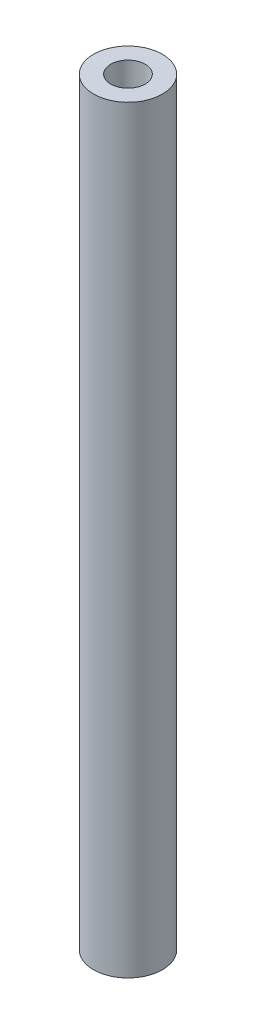
ISO-10303-21;
HEADER;
FILE_DESCRIPTION(('STEP AP214'),'2;1');
FILE_NAME('part.step','',(''),(''),'','','');
FILE_SCHEMA(('AUTOMOTIVE_DESIGN { 1 0 10303 214 1 1 1 1 }'));
ENDSEC;
DATA;
#1=APPLICATION_CONTEXT('core data for automotive mechanical design processes');
#2=APPLICATION_PROTOCOL_DEFINITION('international standard','automotive_design',2000,#1);
#3=PRODUCT_CONTEXT('',#1,'mechanical');
#4=PRODUCT('Part','Part','',(#3));
#5=PRODUCT_RELATED_PRODUCT_CATEGORY('part','',(#4));
#6=PRODUCT_DEFINITION_FORMATION('','',#4);
#7=PRODUCT_DEFINITION_CONTEXT('part definition',#1,'design');
#8=PRODUCT_DEFINITION('design','',#6,#7);
#9=PRODUCT_DEFINITION_SHAPE('','',#8);
#10=(LENGTH_UNIT() NAMED_UNIT(*) SI_UNIT(.MILLI.,.METRE.));
#11=(NAMED_UNIT(*) PLANE_ANGLE_UNIT() SI_UNIT($,.RADIAN.));
#12=(NAMED_UNIT(*) SI_UNIT($,.STERADIAN.) SOLID_ANGLE_UNIT());
#13=UNCERTAINTY_MEASURE_WITH_UNIT(LENGTH_MEASURE(1.E-05),#10,'distance_accuracy_value','');
#14=(GEOMETRIC_REPRESENTATION_CONTEXT(3) GLOBAL_UNCERTAINTY_ASSIGNED_CONTEXT((#13)) GLOBAL_UNIT_ASSIGNED_CONTEXT((#10,
#11,#12)) REPRESENTATION_CONTEXT('',''));
#15=CARTESIAN_POINT('',(0.,0.,0.));
#16=DIRECTION('',(0.,0.,1.));
#17=DIRECTION('',(1.,0.,0.));
#18=AXIS2_PLACEMENT_3D('',#15,#16,#17);
#19=CARTESIAN_POINT('',(-58.1882179487252,55.,19.3502353782833));
#20=DIRECTION('',(0.,-1.,0.));
#21=DIRECTION('',(0.,0.,-1.));
#22=AXIS2_PLACEMENT_3D('',#19,#20,#21);
#23=CYLINDRICAL_SURFACE('',#22,2.5);
#24=CARTESIAN_POINT('',(-58.1882179487252,55.,19.3502353782833));
#25=DIRECTION('',(0.,1.,0.));
#26=DIRECTION('',(0.,0.,1.));
#27=AXIS2_PLACEMENT_3D('',#24,#25,#26);
#28=CIRCLE('',#27,2.5);
#29=CARTESIAN_POINT('',(-58.1882179487252,55.,21.8502353782833));
#30=VERTEX_POINT('',#29);
#31=EDGE_CURVE('E12',#30,#30,#28,.T.);
#32=ORIENTED_EDGE('',*,*,#31,.F.);
#33=EDGE_LOOP('',(#32));
#34=FACE_BOUND('',#33,.T.);
#35=CARTESIAN_POINT('',(-58.1882179487252,0.,19.3502353782833));
#36=DIRECTION('',(0.,1.,0.));
#37=DIRECTION('',(0.,0.,1.));
#38=AXIS2_PLACEMENT_3D('',#35,#36,#37);
#39=CIRCLE('',#38,2.5);
#40=CARTESIAN_POINT('',(-58.1882179487252,0.,21.8502353782833));
#41=VERTEX_POINT('',#40);
#42=EDGE_CURVE('E45',#41,#41,#39,.T.);
#43=ORIENTED_EDGE('',*,*,#42,.T.);
#44=EDGE_LOOP('',(#43));
#45=FACE_BOUND('',#44,.T.);
#46=ADVANCED_FACE('F42',(#34,#45),#23,.T.);
#47=CARTESIAN_POINT('',(-58.1882179487252,55.,19.3502353782833));
#48=DIRECTION('',(0.,1.,0.));
#49=DIRECTION('',(0.,0.,1.));
#50=AXIS2_PLACEMENT_3D('',#47,#48,#49);
#51=PLANE('',#50);
#52=CARTESIAN_POINT('',(-58.1882179487252,55.,19.3502353782833));
#53=DIRECTION('',(0.,1.,0.));
#54=DIRECTION('',(0.,0.,1.));
#55=AXIS2_PLACEMENT_3D('',#52,#53,#54);
#56=CIRCLE('',#55,1.24999999999999);
#57=CARTESIAN_POINT('',(-58.1882179487252,55.,20.6002353782833));
#58=VERTEX_POINT('',#57);
#59=EDGE_CURVE('E56',#58,#58,#56,.T.);
#60=ORIENTED_EDGE('',*,*,#59,.F.);
#61=EDGE_LOOP('',(#60));
#62=FACE_BOUND('',#61,.T.);
#63=ORIENTED_EDGE('',*,*,#31,.T.);
#64=EDGE_LOOP('',(#63));
#65=FACE_BOUND('',#64,.T.);
#66=ADVANCED_FACE('F62',(#62,#65),#51,.T.);
#67=CARTESIAN_POINT('',(-58.1882179487252,0.,19.3502353782833));
#68=DIRECTION('',(0.,1.,0.));
#69=DIRECTION('',(0.,0.,1.));
#70=AXIS2_PLACEMENT_3D('',#67,#68,#69);
#71=PLANE('',#70);
#72=CARTESIAN_POINT('',(-58.1882179487252,0.,19.3502353782833));
#73=DIRECTION('',(0.,1.,0.));
#74=DIRECTION('',(0.,0.,1.));
#75=AXIS2_PLACEMENT_3D('',#72,#73,#74);
#76=CIRCLE('',#75,1.24999999999999);
#77=CARTESIAN_POINT('',(-58.1882179487252,0.,20.6002353782833));
#78=VERTEX_POINT('',#77);
#79=EDGE_CURVE('E52',#78,#78,#76,.T.);
#80=ORIENTED_EDGE('',*,*,#79,.T.);
#81=EDGE_LOOP('',(#80));
#82=FACE_BOUND('',#81,.T.);
#83=ORIENTED_EDGE('',*,*,#42,.F.);
#84=EDGE_LOOP('',(#83));
#85=FACE_BOUND('',#84,.T.);
#86=ADVANCED_FACE('F64',(#82,#85),#71,.F.);
#87=CARTESIAN_POINT('',(-58.1882179487252,55.,19.3502353782833));
#88=DIRECTION('',(0.,1.,0.));
#89=DIRECTION('',(0.,0.,1.));
#90=AXIS2_PLACEMENT_3D('',#87,#88,#89);
#91=CYLINDRICAL_SURFACE('',#90,1.24999999999999);
#92=ORIENTED_EDGE('',*,*,#79,.F.);
#93=EDGE_LOOP('',(#92));
#94=FACE_BOUND('',#93,.T.);
#95=ORIENTED_EDGE('',*,*,#59,.T.);
#96=EDGE_LOOP('',(#95));
#97=FACE_BOUND('',#96,.T.);
#98=ADVANCED_FACE('F60',(#94,#97),#91,.F.);
#99=CLOSED_SHELL('',(#46,#66,#86,#98));
#100=MANIFOLD_SOLID_BREP('B2',#99);
#101=ADVANCED_BREP_SHAPE_REPRESENTATION('',(#18,#100),#14);
#102=SHAPE_DEFINITION_REPRESENTATION(#9,#101);
ENDSEC;
END-ISO-10303-21;
